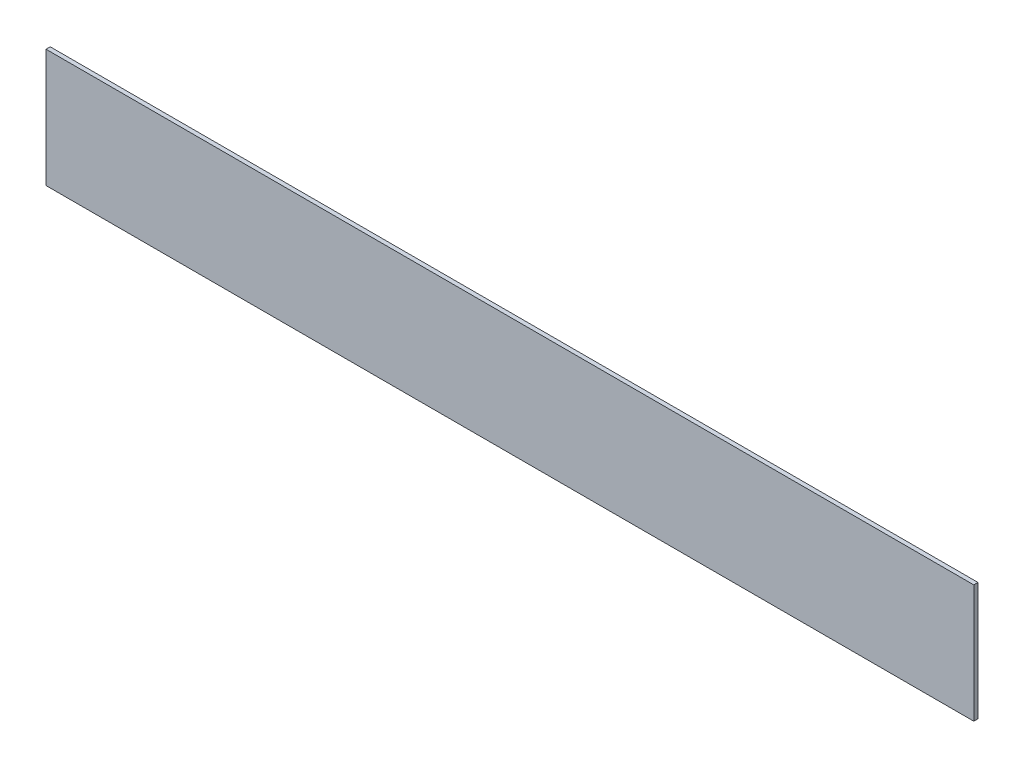
ISO-10303-21;
HEADER;
FILE_DESCRIPTION(('STEP AP214'),'2;1');
FILE_NAME('part.step','',(''),(''),'','','');
FILE_SCHEMA(('AUTOMOTIVE_DESIGN { 1 0 10303 214 1 1 1 1 }'));
ENDSEC;
DATA;
#1=APPLICATION_CONTEXT('core data for automotive mechanical design processes');
#2=APPLICATION_PROTOCOL_DEFINITION('international standard','automotive_design',2000,#1);
#3=PRODUCT_CONTEXT('',#1,'mechanical');
#4=PRODUCT('Part','Part','',(#3));
#5=PRODUCT_RELATED_PRODUCT_CATEGORY('part','',(#4));
#6=PRODUCT_DEFINITION_FORMATION('','',#4);
#7=PRODUCT_DEFINITION_CONTEXT('part definition',#1,'design');
#8=PRODUCT_DEFINITION('design','',#6,#7);
#9=PRODUCT_DEFINITION_SHAPE('','',#8);
#10=(LENGTH_UNIT() NAMED_UNIT(*) SI_UNIT(.MILLI.,.METRE.));
#11=(NAMED_UNIT(*) PLANE_ANGLE_UNIT() SI_UNIT($,.RADIAN.));
#12=(NAMED_UNIT(*) SI_UNIT($,.STERADIAN.) SOLID_ANGLE_UNIT());
#13=UNCERTAINTY_MEASURE_WITH_UNIT(LENGTH_MEASURE(1.E-05),#10,'distance_accuracy_value','');
#14=(GEOMETRIC_REPRESENTATION_CONTEXT(3) GLOBAL_UNCERTAINTY_ASSIGNED_CONTEXT((#13)) GLOBAL_UNIT_ASSIGNED_CONTEXT((#10,
#11,#12)) REPRESENTATION_CONTEXT('',''));
#15=CARTESIAN_POINT('',(0.,0.,0.));
#16=DIRECTION('',(0.,0.,1.));
#17=DIRECTION('',(1.,0.,0.));
#18=AXIS2_PLACEMENT_3D('',#15,#16,#17);
#19=CARTESIAN_POINT('',(349.25,-44.45,1.5875));
#20=DIRECTION('',(-1.,0.,0.));
#21=DIRECTION('',(0.,0.,1.));
#22=AXIS2_PLACEMENT_3D('',#19,#20,#21);
#23=PLANE('',#22);
#24=DIRECTION('',(0.,1.,0.));
#25=VECTOR('',#24,1.);
#26=CARTESIAN_POINT('',(349.25,-44.45,-1.5875));
#27=LINE('',#26,#25);
#28=CARTESIAN_POINT('',(349.25,-44.45,-1.5875));
#29=VERTEX_POINT('',#28);
#30=CARTESIAN_POINT('',(349.25,44.45,-1.5875));
#31=VERTEX_POINT('',#30);
#32=EDGE_CURVE('E96',#29,#31,#27,.T.);
#33=ORIENTED_EDGE('',*,*,#32,.T.);
#34=DIRECTION('',(0.,0.,-1.));
#35=VECTOR('',#34,1.);
#36=CARTESIAN_POINT('',(349.25,44.45,1.5875));
#37=LINE('',#36,#35);
#38=CARTESIAN_POINT('',(349.25,44.45,1.5875));
#39=VERTEX_POINT('',#38);
#40=EDGE_CURVE('E11',#39,#31,#37,.T.);
#41=ORIENTED_EDGE('',*,*,#40,.F.);
#42=DIRECTION('',(0.,1.,0.));
#43=VECTOR('',#42,1.);
#44=CARTESIAN_POINT('',(349.25,-44.45,1.5875));
#45=LINE('',#44,#43);
#46=CARTESIAN_POINT('',(349.25,-44.45,1.5875));
#47=VERTEX_POINT('',#46);
#48=EDGE_CURVE('E84',#47,#39,#45,.T.);
#49=ORIENTED_EDGE('',*,*,#48,.F.);
#50=DIRECTION('',(0.,0.,-1.));
#51=VECTOR('',#50,1.);
#52=CARTESIAN_POINT('',(349.25,-44.45,1.5875));
#53=LINE('',#52,#51);
#54=EDGE_CURVE('E92',#47,#29,#53,.T.);
#55=ORIENTED_EDGE('',*,*,#54,.T.);
#56=EDGE_LOOP('',(#33,#41,#49,#55));
#57=FACE_BOUND('',#56,.T.);
#58=ADVANCED_FACE('F33',(#57),#23,.F.);
#59=CARTESIAN_POINT('',(-349.25,44.45,1.5875));
#60=DIRECTION('',(0.,-1.,0.));
#61=DIRECTION('',(0.,0.,-1.));
#62=AXIS2_PLACEMENT_3D('',#59,#60,#61);
#63=PLANE('',#62);
#64=DIRECTION('',(-1.,0.,0.));
#65=VECTOR('',#64,1.);
#66=CARTESIAN_POINT('',(-349.25,44.45,-1.5875));
#67=LINE('',#66,#65);
#68=CARTESIAN_POINT('',(-349.25,44.45,-1.5875));
#69=VERTEX_POINT('',#68);
#70=EDGE_CURVE('E88',#31,#69,#67,.T.);
#71=ORIENTED_EDGE('',*,*,#70,.T.);
#72=DIRECTION('',(0.,0.,-1.));
#73=VECTOR('',#72,1.);
#74=CARTESIAN_POINT('',(-349.25,44.45,1.5875));
#75=LINE('',#74,#73);
#76=CARTESIAN_POINT('',(-349.25,44.45,1.5875));
#77=VERTEX_POINT('',#76);
#78=EDGE_CURVE('E41',#77,#69,#75,.T.);
#79=ORIENTED_EDGE('',*,*,#78,.F.);
#80=DIRECTION('',(-1.,0.,0.));
#81=VECTOR('',#80,1.);
#82=CARTESIAN_POINT('',(-349.25,44.45,1.5875));
#83=LINE('',#82,#81);
#84=EDGE_CURVE('E79',#39,#77,#83,.T.);
#85=ORIENTED_EDGE('',*,*,#84,.F.);
#86=ORIENTED_EDGE('',*,*,#40,.T.);
#87=EDGE_LOOP('',(#71,#79,#85,#86));
#88=FACE_BOUND('',#87,.T.);
#89=ADVANCED_FACE('F87',(#88),#63,.F.);
#90=CARTESIAN_POINT('',(-349.25,-44.45,1.5875));
#91=DIRECTION('',(1.,0.,0.));
#92=DIRECTION('',(0.,0.,-1.));
#93=AXIS2_PLACEMENT_3D('',#90,#91,#92);
#94=PLANE('',#93);
#95=DIRECTION('',(0.,-1.,0.));
#96=VECTOR('',#95,1.);
#97=CARTESIAN_POINT('',(-349.25,-44.45,-1.5875));
#98=LINE('',#97,#96);
#99=CARTESIAN_POINT('',(-349.25,-44.45,-1.5875));
#100=VERTEX_POINT('',#99);
#101=EDGE_CURVE('E66',#69,#100,#98,.T.);
#102=ORIENTED_EDGE('',*,*,#101,.T.);
#103=DIRECTION('',(0.,0.,-1.));
#104=VECTOR('',#103,1.);
#105=CARTESIAN_POINT('',(-349.25,-44.45,1.5875));
#106=LINE('',#105,#104);
#107=CARTESIAN_POINT('',(-349.25,-44.45,1.5875));
#108=VERTEX_POINT('',#107);
#109=EDGE_CURVE('E89',#108,#100,#106,.T.);
#110=ORIENTED_EDGE('',*,*,#109,.F.);
#111=DIRECTION('',(0.,-1.,0.));
#112=VECTOR('',#111,1.);
#113=CARTESIAN_POINT('',(-349.25,-44.45,1.5875));
#114=LINE('',#113,#112);
#115=EDGE_CURVE('E82',#77,#108,#114,.T.);
#116=ORIENTED_EDGE('',*,*,#115,.F.);
#117=ORIENTED_EDGE('',*,*,#78,.T.);
#118=EDGE_LOOP('',(#102,#110,#116,#117));
#119=FACE_BOUND('',#118,.T.);
#120=ADVANCED_FACE('F90',(#119),#94,.F.);
#121=CARTESIAN_POINT('',(-349.25,-44.45,1.5875));
#122=DIRECTION('',(0.,1.,0.));
#123=DIRECTION('',(0.,0.,1.));
#124=AXIS2_PLACEMENT_3D('',#121,#122,#123);
#125=PLANE('',#124);
#126=DIRECTION('',(1.,0.,0.));
#127=VECTOR('',#126,1.);
#128=CARTESIAN_POINT('',(-349.25,-44.45,-1.5875));
#129=LINE('',#128,#127);
#130=EDGE_CURVE('E72',#100,#29,#129,.T.);
#131=ORIENTED_EDGE('',*,*,#130,.T.);
#132=ORIENTED_EDGE('',*,*,#54,.F.);
#133=DIRECTION('',(1.,0.,0.));
#134=VECTOR('',#133,1.);
#135=CARTESIAN_POINT('',(-349.25,-44.45,1.5875));
#136=LINE('',#135,#134);
#137=EDGE_CURVE('E49',#108,#47,#136,.T.);
#138=ORIENTED_EDGE('',*,*,#137,.F.);
#139=ORIENTED_EDGE('',*,*,#109,.T.);
#140=EDGE_LOOP('',(#131,#132,#138,#139));
#141=FACE_BOUND('',#140,.T.);
#142=ADVANCED_FACE('F103',(#141),#125,.F.);
#143=CARTESIAN_POINT('',(0.,0.,1.5875));
#144=DIRECTION('',(0.,0.,-1.));
#145=DIRECTION('',(-1.,0.,0.));
#146=AXIS2_PLACEMENT_3D('',#143,#144,#145);
#147=PLANE('',#146);
#148=ORIENTED_EDGE('',*,*,#48,.T.);
#149=ORIENTED_EDGE('',*,*,#84,.T.);
#150=ORIENTED_EDGE('',*,*,#115,.T.);
#151=ORIENTED_EDGE('',*,*,#137,.T.);
#152=EDGE_LOOP('',(#148,#149,#150,#151));
#153=FACE_BOUND('',#152,.T.);
#154=ADVANCED_FACE('F80',(#153),#147,.F.);
#155=CARTESIAN_POINT('',(0.,0.,-1.5875));
#156=DIRECTION('',(0.,0.,-1.));
#157=DIRECTION('',(-1.,0.,0.));
#158=AXIS2_PLACEMENT_3D('',#155,#156,#157);
#159=PLANE('',#158);
#160=ORIENTED_EDGE('',*,*,#32,.F.);
#161=ORIENTED_EDGE('',*,*,#130,.F.);
#162=ORIENTED_EDGE('',*,*,#101,.F.);
#163=ORIENTED_EDGE('',*,*,#70,.F.);
#164=EDGE_LOOP('',(#160,#161,#162,#163));
#165=FACE_BOUND('',#164,.T.);
#166=ADVANCED_FACE('F106',(#165),#159,.T.);
#167=CLOSED_SHELL('',(#58,#89,#120,#142,#154,#166));
#168=MANIFOLD_SOLID_BREP('B2',#167);
#169=ADVANCED_BREP_SHAPE_REPRESENTATION('',(#18,#168),#14);
#170=SHAPE_DEFINITION_REPRESENTATION(#9,#169);
ENDSEC;
END-ISO-10303-21;
